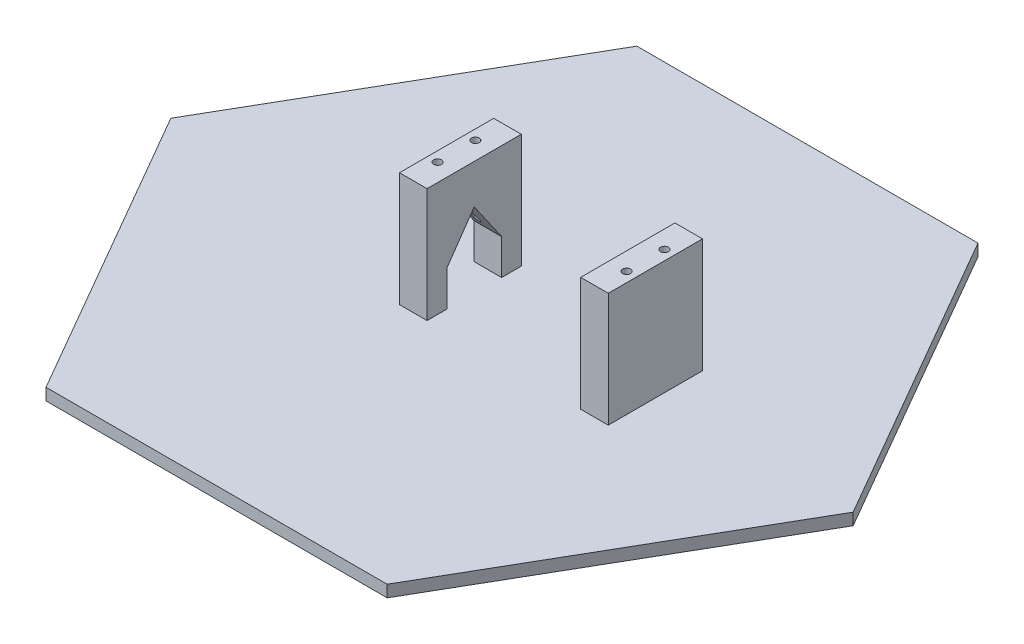
ISO-10303-21;
HEADER;
FILE_DESCRIPTION(('STEP AP214'),'2;1');
FILE_NAME('part.step','',(''),(''),'','','');
FILE_SCHEMA(('AUTOMOTIVE_DESIGN { 1 0 10303 214 1 1 1 1 }'));
ENDSEC;
DATA;
#1=APPLICATION_CONTEXT('core data for automotive mechanical design processes');
#2=APPLICATION_PROTOCOL_DEFINITION('international standard','automotive_design',2000,#1);
#3=PRODUCT_CONTEXT('',#1,'mechanical');
#4=PRODUCT('Part','Part','',(#3));
#5=PRODUCT_RELATED_PRODUCT_CATEGORY('part','',(#4));
#6=PRODUCT_DEFINITION_FORMATION('','',#4);
#7=PRODUCT_DEFINITION_CONTEXT('part definition',#1,'design');
#8=PRODUCT_DEFINITION('design','',#6,#7);
#9=PRODUCT_DEFINITION_SHAPE('','',#8);
#10=(LENGTH_UNIT() NAMED_UNIT(*) SI_UNIT(.MILLI.,.METRE.));
#11=(NAMED_UNIT(*) PLANE_ANGLE_UNIT() SI_UNIT($,.RADIAN.));
#12=(NAMED_UNIT(*) SI_UNIT($,.STERADIAN.) SOLID_ANGLE_UNIT());
#13=UNCERTAINTY_MEASURE_WITH_UNIT(LENGTH_MEASURE(1.E-05),#10,'distance_accuracy_value','');
#14=(GEOMETRIC_REPRESENTATION_CONTEXT(3) GLOBAL_UNCERTAINTY_ASSIGNED_CONTEXT((#13)) GLOBAL_UNIT_ASSIGNED_CONTEXT((#10,
#11,#12)) REPRESENTATION_CONTEXT('',''));
#15=CARTESIAN_POINT('',(0.,0.,0.));
#16=DIRECTION('',(0.,0.,1.));
#17=DIRECTION('',(1.,0.,0.));
#18=AXIS2_PLACEMENT_3D('',#15,#16,#17);
#19=CARTESIAN_POINT('',(-16.6,32.,6.96020627017977));
#20=DIRECTION('',(0.,0.,1.));
#21=DIRECTION('',(1.,0.,0.));
#22=AXIS2_PLACEMENT_3D('',#19,#20,#21);
#23=PLANE('',#22);
#24=DIRECTION('',(-1.,0.,0.));
#25=VECTOR('',#24,1.);
#26=CARTESIAN_POINT('',(14.7675580494599,12.,6.96020627017977));
#27=LINE('',#26,#25);
#28=CARTESIAN_POINT('',(-9.59999999999998,12.,6.96020627017977));
#29=VERTEX_POINT('',#28);
#30=CARTESIAN_POINT('',(-16.6,12.,6.96020627017977));
#31=VERTEX_POINT('',#30);
#32=EDGE_CURVE('E189',#29,#31,#27,.T.);
#33=ORIENTED_EDGE('',*,*,#32,.F.);
#34=DIRECTION('',(0.,-1.,0.));
#35=VECTOR('',#34,1.);
#36=CARTESIAN_POINT('',(-9.6,32.,6.96020627017977));
#37=LINE('',#36,#35);
#38=CARTESIAN_POINT('',(-9.6,3.,6.96020627017977));
#39=VERTEX_POINT('',#38);
#40=EDGE_CURVE('E323',#29,#39,#37,.T.);
#41=ORIENTED_EDGE('',*,*,#40,.T.);
#42=DIRECTION('',(-1.,0.,0.));
#43=VECTOR('',#42,1.);
#44=CARTESIAN_POINT('',(-16.6,3.,6.96020627017977));
#45=LINE('',#44,#43);
#46=CARTESIAN_POINT('',(-16.6,3.,6.96020627017977));
#47=VERTEX_POINT('',#46);
#48=EDGE_CURVE('E307',#39,#47,#45,.T.);
#49=ORIENTED_EDGE('',*,*,#48,.T.);
#50=DIRECTION('',(0.,-1.,0.));
#51=VECTOR('',#50,1.);
#52=CARTESIAN_POINT('',(-16.6,32.,6.96020627017977));
#53=LINE('',#52,#51);
#54=EDGE_CURVE('E306',#31,#47,#53,.T.);
#55=ORIENTED_EDGE('',*,*,#54,.F.);
#56=EDGE_LOOP('',(#33,#41,#49,#55));
#57=FACE_BOUND('',#56,.T.);
#58=ADVANCED_FACE('F45',(#57),#23,.F.);
#59=CARTESIAN_POINT('',(0.,3.,0.));
#60=DIRECTION('',(0.,1.,0.));
#61=DIRECTION('',(0.,0.,1.));
#62=AXIS2_PLACEMENT_3D('',#59,#60,#61);
#63=PLANE('',#62);
#64=DIRECTION('',(0.,0.,1.));
#65=VECTOR('',#64,1.);
#66=CARTESIAN_POINT('',(-16.6,3.,-6.96020627017977));
#67=LINE('',#66,#65);
#68=CARTESIAN_POINT('',(-16.6,3.,-11.9602062701798));
#69=VERTEX_POINT('',#68);
#70=CARTESIAN_POINT('',(-16.6,3.,-6.96020627017977));
#71=VERTEX_POINT('',#70);
#72=EDGE_CURVE('E288',#69,#71,#67,.T.);
#73=ORIENTED_EDGE('',*,*,#72,.F.);
#74=DIRECTION('',(-1.,0.,0.));
#75=VECTOR('',#74,1.);
#76=CARTESIAN_POINT('',(-16.6,3.,-11.9602062701798));
#77=LINE('',#76,#75);
#78=CARTESIAN_POINT('',(-9.6,3.,-11.9602062701798));
#79=VERTEX_POINT('',#78);
#80=EDGE_CURVE('E224',#79,#69,#77,.T.);
#81=ORIENTED_EDGE('',*,*,#80,.F.);
#82=DIRECTION('',(0.,0.,-1.));
#83=VECTOR('',#82,1.);
#84=CARTESIAN_POINT('',(-9.6,3.,-11.9602062701798));
#85=LINE('',#84,#83);
#86=CARTESIAN_POINT('',(-9.6,3.,-6.96020627017977));
#87=VERTEX_POINT('',#86);
#88=EDGE_CURVE('E281',#87,#79,#85,.T.);
#89=ORIENTED_EDGE('',*,*,#88,.F.);
#90=DIRECTION('',(1.,0.,0.));
#91=VECTOR('',#90,1.);
#92=CARTESIAN_POINT('',(-16.6,3.,-6.96020627017977));
#93=LINE('',#92,#91);
#94=EDGE_CURVE('E284',#71,#87,#93,.T.);
#95=ORIENTED_EDGE('',*,*,#94,.F.);
#96=EDGE_LOOP('',(#73,#81,#89,#95));
#97=FACE_BOUND('',#96,.T.);
#98=DIRECTION('',(1.,0.,0.));
#99=VECTOR('',#98,1.);
#100=CARTESIAN_POINT('',(-9.6,3.,11.9602062701798));
#101=LINE('',#100,#99);
#102=CARTESIAN_POINT('',(-16.6,3.,11.9602062701798));
#103=VERTEX_POINT('',#102);
#104=CARTESIAN_POINT('',(-9.6,3.,11.9602062701798));
#105=VERTEX_POINT('',#104);
#106=EDGE_CURVE('E311',#103,#105,#101,.T.);
#107=ORIENTED_EDGE('',*,*,#106,.F.);
#108=DIRECTION('',(0.,0.,1.));
#109=VECTOR('',#108,1.);
#110=CARTESIAN_POINT('',(-16.6,3.,11.9602062701798));
#111=LINE('',#110,#109);
#112=EDGE_CURVE('E268',#47,#103,#111,.T.);
#113=ORIENTED_EDGE('',*,*,#112,.F.);
#114=ORIENTED_EDGE('',*,*,#48,.F.);
#115=DIRECTION('',(0.,0.,-1.));
#116=VECTOR('',#115,1.);
#117=CARTESIAN_POINT('',(-9.6,3.,6.96020627017977));
#118=LINE('',#117,#116);
#119=EDGE_CURVE('E314',#105,#39,#118,.T.);
#120=ORIENTED_EDGE('',*,*,#119,.F.);
#121=EDGE_LOOP('',(#107,#113,#114,#120));
#122=FACE_BOUND('',#121,.T.);
#123=DIRECTION('',(0.499999999999999,0.,-0.866025403784439));
#124=VECTOR('',#123,1.);
#125=CARTESIAN_POINT('',(43.3012701892216,3.,75.0000000000003));
#126=LINE('',#125,#124);
#127=CARTESIAN_POINT('',(43.3012701892216,3.,75.0000000000003));
#128=VERTEX_POINT('',#127);
#129=CARTESIAN_POINT('',(86.6025403784436,3.,0.));
#130=VERTEX_POINT('',#129);
#131=EDGE_CURVE('E334',#128,#130,#126,.T.);
#132=ORIENTED_EDGE('',*,*,#131,.T.);
#133=DIRECTION('',(-0.499999999999999,0.,-0.866025403784439));
#134=VECTOR('',#133,1.);
#135=CARTESIAN_POINT('',(86.6025403784436,3.,0.));
#136=LINE('',#135,#134);
#137=CARTESIAN_POINT('',(43.3012701892215,3.,-75.0000000000006));
#138=VERTEX_POINT('',#137);
#139=EDGE_CURVE('E338',#130,#138,#136,.T.);
#140=ORIENTED_EDGE('',*,*,#139,.T.);
#141=DIRECTION('',(-1.,0.,0.));
#142=VECTOR('',#141,1.);
#143=CARTESIAN_POINT('',(43.3012701892215,3.,-75.0000000000006));
#144=LINE('',#143,#142);
#145=CARTESIAN_POINT('',(-43.301270189222,3.,-75.0000000000006));
#146=VERTEX_POINT('',#145);
#147=EDGE_CURVE('E342',#138,#146,#144,.T.);
#148=ORIENTED_EDGE('',*,*,#147,.T.);
#149=DIRECTION('',(-0.5,0.,0.866025403784439));
#150=VECTOR('',#149,1.);
#151=CARTESIAN_POINT('',(-43.301270189222,3.,-75.0000000000006));
#152=LINE('',#151,#150);
#153=CARTESIAN_POINT('',(-86.6025403784443,3.,-1.25718795044171E-13));
#154=VERTEX_POINT('',#153);
#155=EDGE_CURVE('E345',#146,#154,#152,.T.);
#156=ORIENTED_EDGE('',*,*,#155,.T.);
#157=DIRECTION('',(0.499999999999999,0.,0.866025403784439));
#158=VECTOR('',#157,1.);
#159=CARTESIAN_POINT('',(-86.6025403784443,3.,-1.25718795044171E-13));
#160=LINE('',#159,#158);
#161=CARTESIAN_POINT('',(-43.3012701892223,3.,75.0000000000003));
#162=VERTEX_POINT('',#161);
#163=EDGE_CURVE('E348',#154,#162,#160,.T.);
#164=ORIENTED_EDGE('',*,*,#163,.T.);
#165=DIRECTION('',(1.,0.,0.));
#166=VECTOR('',#165,1.);
#167=CARTESIAN_POINT('',(-43.3012701892223,3.,75.0000000000003));
#168=LINE('',#167,#166);
#169=EDGE_CURVE('E351',#162,#128,#168,.T.);
#170=ORIENTED_EDGE('',*,*,#169,.T.);
#171=EDGE_LOOP('',(#132,#140,#148,#156,#164,#170));
#172=FACE_BOUND('',#171,.T.);
#173=DIRECTION('',(0.,0.,1.));
#174=VECTOR('',#173,1.);
#175=CARTESIAN_POINT('',(29.4,3.,-11.9602062701798));
#176=LINE('',#175,#174);
#177=CARTESIAN_POINT('',(29.4,3.,-11.9602062701798));
#178=VERTEX_POINT('',#177);
#179=CARTESIAN_POINT('',(29.4,3.,11.9602062701798));
#180=VERTEX_POINT('',#179);
#181=EDGE_CURVE('E242',#178,#180,#176,.T.);
#182=ORIENTED_EDGE('',*,*,#181,.F.);
#183=DIRECTION('',(-1.,0.,0.));
#184=VECTOR('',#183,1.);
#185=CARTESIAN_POINT('',(29.4,3.,-11.9602062701798));
#186=LINE('',#185,#184);
#187=CARTESIAN_POINT('',(36.4,3.,-11.9602062701798));
#188=VERTEX_POINT('',#187);
#189=EDGE_CURVE('E245',#188,#178,#186,.T.);
#190=ORIENTED_EDGE('',*,*,#189,.F.);
#191=DIRECTION('',(0.,0.,-1.));
#192=VECTOR('',#191,1.);
#193=CARTESIAN_POINT('',(36.4,3.,11.9602062701798));
#194=LINE('',#193,#192);
#195=CARTESIAN_POINT('',(36.4,3.,11.9602062701798));
#196=VERTEX_POINT('',#195);
#197=EDGE_CURVE('E235',#196,#188,#194,.T.);
#198=ORIENTED_EDGE('',*,*,#197,.F.);
#199=DIRECTION('',(1.,0.,0.));
#200=VECTOR('',#199,1.);
#201=CARTESIAN_POINT('',(29.4,3.,11.9602062701798));
#202=LINE('',#201,#200);
#203=EDGE_CURVE('E238',#180,#196,#202,.T.);
#204=ORIENTED_EDGE('',*,*,#203,.F.);
#205=EDGE_LOOP('',(#182,#190,#198,#204));
#206=FACE_BOUND('',#205,.T.);
#207=ADVANCED_FACE('F404',(#97,#122,#172,#206),#63,.T.);
#208=CARTESIAN_POINT('',(43.3012701892216,3.,75.0000000000003));
#209=DIRECTION('',(-0.866025403784439,0.,-0.5));
#210=DIRECTION('',(-0.5,0.,0.866025403784439));
#211=AXIS2_PLACEMENT_3D('',#208,#209,#210);
#212=PLANE('',#211);
#213=DIRECTION('',(0.499999999999999,0.,-0.866025403784439));
#214=VECTOR('',#213,1.);
#215=CARTESIAN_POINT('',(43.3012701892216,0.,75.0000000000003));
#216=LINE('',#215,#214);
#217=CARTESIAN_POINT('',(43.3012701892216,0.,75.0000000000003));
#218=VERTEX_POINT('',#217);
#219=CARTESIAN_POINT('',(86.6025403784436,0.,0.));
#220=VERTEX_POINT('',#219);
#221=EDGE_CURVE('E333',#218,#220,#216,.T.);
#222=ORIENTED_EDGE('',*,*,#221,.T.);
#223=DIRECTION('',(0.,-1.,0.));
#224=VECTOR('',#223,1.);
#225=CARTESIAN_POINT('',(86.6025403784436,3.,0.));
#226=LINE('',#225,#224);
#227=EDGE_CURVE('E391',#130,#220,#226,.T.);
#228=ORIENTED_EDGE('',*,*,#227,.F.);
#229=ORIENTED_EDGE('',*,*,#131,.F.);
#230=DIRECTION('',(0.,-1.,0.));
#231=VECTOR('',#230,1.);
#232=CARTESIAN_POINT('',(43.3012701892216,3.,75.0000000000003));
#233=LINE('',#232,#231);
#234=EDGE_CURVE('E354',#128,#218,#233,.T.);
#235=ORIENTED_EDGE('',*,*,#234,.T.);
#236=EDGE_LOOP('',(#222,#228,#229,#235));
#237=FACE_BOUND('',#236,.T.);
#238=ADVANCED_FACE('F47',(#237),#212,.F.);
#239=CARTESIAN_POINT('',(86.6025403784436,3.,0.));
#240=DIRECTION('',(-0.866025403784439,0.,0.499999999999999));
#241=DIRECTION('',(0.499999999999999,0.,0.866025403784439));
#242=AXIS2_PLACEMENT_3D('',#239,#240,#241);
#243=PLANE('',#242);
#244=DIRECTION('',(-0.499999999999999,0.,-0.866025403784439));
#245=VECTOR('',#244,1.);
#246=CARTESIAN_POINT('',(86.6025403784436,0.,0.));
#247=LINE('',#246,#245);
#248=CARTESIAN_POINT('',(43.3012701892215,0.,-75.0000000000006));
#249=VERTEX_POINT('',#248);
#250=EDGE_CURVE('E358',#220,#249,#247,.T.);
#251=ORIENTED_EDGE('',*,*,#250,.T.);
#252=DIRECTION('',(0.,-1.,0.));
#253=VECTOR('',#252,1.);
#254=CARTESIAN_POINT('',(43.3012701892215,3.,-75.0000000000006));
#255=LINE('',#254,#253);
#256=EDGE_CURVE('E387',#138,#249,#255,.T.);
#257=ORIENTED_EDGE('',*,*,#256,.F.);
#258=ORIENTED_EDGE('',*,*,#139,.F.);
#259=ORIENTED_EDGE('',*,*,#227,.T.);
#260=EDGE_LOOP('',(#251,#257,#258,#259));
#261=FACE_BOUND('',#260,.T.);
#262=ADVANCED_FACE('F704',(#261),#243,.F.);
#263=CARTESIAN_POINT('',(43.3012701892215,3.,-75.0000000000006));
#264=DIRECTION('',(0.,0.,1.));
#265=DIRECTION('',(1.,0.,0.));
#266=AXIS2_PLACEMENT_3D('',#263,#264,#265);
#267=PLANE('',#266);
#268=DIRECTION('',(-1.,0.,0.));
#269=VECTOR('',#268,1.);
#270=CARTESIAN_POINT('',(43.3012701892215,0.,-75.0000000000006));
#271=LINE('',#270,#269);
#272=CARTESIAN_POINT('',(-43.301270189222,0.,-75.0000000000006));
#273=VERTEX_POINT('',#272);
#274=EDGE_CURVE('E361',#249,#273,#271,.T.);
#275=ORIENTED_EDGE('',*,*,#274,.T.);
#276=DIRECTION('',(0.,-1.,0.));
#277=VECTOR('',#276,1.);
#278=CARTESIAN_POINT('',(-43.301270189222,3.,-75.0000000000006));
#279=LINE('',#278,#277);
#280=EDGE_CURVE('E383',#146,#273,#279,.T.);
#281=ORIENTED_EDGE('',*,*,#280,.F.);
#282=ORIENTED_EDGE('',*,*,#147,.F.);
#283=ORIENTED_EDGE('',*,*,#256,.T.);
#284=EDGE_LOOP('',(#275,#281,#282,#283));
#285=FACE_BOUND('',#284,.T.);
#286=ADVANCED_FACE('F695',(#285),#267,.F.);
#287=CARTESIAN_POINT('',(-43.301270189222,3.,-75.0000000000006));
#288=DIRECTION('',(0.866025403784438,0.,0.5));
#289=DIRECTION('',(0.5,0.,-0.866025403784439));
#290=AXIS2_PLACEMENT_3D('',#287,#288,#289);
#291=PLANE('',#290);
#292=DIRECTION('',(-0.5,0.,0.866025403784439));
#293=VECTOR('',#292,1.);
#294=CARTESIAN_POINT('',(-43.301270189222,0.,-75.0000000000006));
#295=LINE('',#294,#293);
#296=CARTESIAN_POINT('',(-86.6025403784443,0.,-1.25718795044171E-13));
#297=VERTEX_POINT('',#296);
#298=EDGE_CURVE('E364',#273,#297,#295,.T.);
#299=ORIENTED_EDGE('',*,*,#298,.T.);
#300=DIRECTION('',(0.,-1.,0.));
#301=VECTOR('',#300,1.);
#302=CARTESIAN_POINT('',(-86.6025403784443,3.,-1.25718795044171E-13));
#303=LINE('',#302,#301);
#304=EDGE_CURVE('E379',#154,#297,#303,.T.);
#305=ORIENTED_EDGE('',*,*,#304,.F.);
#306=ORIENTED_EDGE('',*,*,#155,.F.);
#307=ORIENTED_EDGE('',*,*,#280,.T.);
#308=EDGE_LOOP('',(#299,#305,#306,#307));
#309=FACE_BOUND('',#308,.T.);
#310=ADVANCED_FACE('F686',(#309),#291,.F.);
#311=CARTESIAN_POINT('',(-86.6025403784443,3.,-1.25718795044171E-13));
#312=DIRECTION('',(0.866025403784439,0.,-0.499999999999999));
#313=DIRECTION('',(-0.499999999999999,0.,-0.866025403784439));
#314=AXIS2_PLACEMENT_3D('',#311,#312,#313);
#315=PLANE('',#314);
#316=DIRECTION('',(0.499999999999999,0.,0.866025403784439));
#317=VECTOR('',#316,1.);
#318=CARTESIAN_POINT('',(-86.6025403784443,0.,-1.25718795044171E-13));
#319=LINE('',#318,#317);
#320=CARTESIAN_POINT('',(-43.3012701892223,0.,75.0000000000003));
#321=VERTEX_POINT('',#320);
#322=EDGE_CURVE('E367',#297,#321,#319,.T.);
#323=ORIENTED_EDGE('',*,*,#322,.T.);
#324=DIRECTION('',(0.,-1.,0.));
#325=VECTOR('',#324,1.);
#326=CARTESIAN_POINT('',(-43.3012701892223,3.,75.0000000000003));
#327=LINE('',#326,#325);
#328=EDGE_CURVE('E375',#162,#321,#327,.T.);
#329=ORIENTED_EDGE('',*,*,#328,.F.);
#330=ORIENTED_EDGE('',*,*,#163,.F.);
#331=ORIENTED_EDGE('',*,*,#304,.T.);
#332=EDGE_LOOP('',(#323,#329,#330,#331));
#333=FACE_BOUND('',#332,.T.);
#334=ADVANCED_FACE('F677',(#333),#315,.F.);
#335=CARTESIAN_POINT('',(-43.3012701892223,3.,75.0000000000003));
#336=DIRECTION('',(0.,0.,-1.));
#337=DIRECTION('',(-1.,0.,0.));
#338=AXIS2_PLACEMENT_3D('',#335,#336,#337);
#339=PLANE('',#338);
#340=DIRECTION('',(1.,0.,0.));
#341=VECTOR('',#340,1.);
#342=CARTESIAN_POINT('',(-43.3012701892223,0.,75.0000000000003));
#343=LINE('',#342,#341);
#344=EDGE_CURVE('E339',#321,#218,#343,.T.);
#345=ORIENTED_EDGE('',*,*,#344,.T.);
#346=ORIENTED_EDGE('',*,*,#234,.F.);
#347=ORIENTED_EDGE('',*,*,#169,.F.);
#348=ORIENTED_EDGE('',*,*,#328,.T.);
#349=EDGE_LOOP('',(#345,#346,#347,#348));
#350=FACE_BOUND('',#349,.T.);
#351=ADVANCED_FACE('F437',(#350),#339,.F.);
#352=CARTESIAN_POINT('',(0.,0.,0.));
#353=DIRECTION('',(0.,1.,0.));
#354=DIRECTION('',(0.,0.,1.));
#355=AXIS2_PLACEMENT_3D('',#352,#353,#354);
#356=PLANE('',#355);
#357=ORIENTED_EDGE('',*,*,#221,.F.);
#358=ORIENTED_EDGE('',*,*,#344,.F.);
#359=ORIENTED_EDGE('',*,*,#322,.F.);
#360=ORIENTED_EDGE('',*,*,#298,.F.);
#361=ORIENTED_EDGE('',*,*,#274,.F.);
#362=ORIENTED_EDGE('',*,*,#250,.F.);
#363=EDGE_LOOP('',(#357,#358,#359,#360,#361,#362));
#364=FACE_BOUND('',#363,.T.);
#365=ADVANCED_FACE('F429',(#364),#356,.F.);
#366=CARTESIAN_POINT('',(-9.6,32.,11.9602062701798));
#367=DIRECTION('',(0.,0.,-1.));
#368=DIRECTION('',(-1.,0.,0.));
#369=AXIS2_PLACEMENT_3D('',#366,#367,#368);
#370=PLANE('',#369);
#371=ORIENTED_EDGE('',*,*,#106,.T.);
#372=DIRECTION('',(0.,-1.,0.));
#373=VECTOR('',#372,1.);
#374=CARTESIAN_POINT('',(-9.6,32.,11.9602062701798));
#375=LINE('',#374,#373);
#376=CARTESIAN_POINT('',(-9.6,32.,11.9602062701798));
#377=VERTEX_POINT('',#376);
#378=EDGE_CURVE('E326',#377,#105,#375,.T.);
#379=ORIENTED_EDGE('',*,*,#378,.F.);
#380=DIRECTION('',(1.,0.,0.));
#381=VECTOR('',#380,1.);
#382=CARTESIAN_POINT('',(-9.6,32.,11.9602062701798));
#383=LINE('',#382,#381);
#384=CARTESIAN_POINT('',(-16.6,32.,11.9602062701798));
#385=VERTEX_POINT('',#384);
#386=EDGE_CURVE('E302',#385,#377,#383,.T.);
#387=ORIENTED_EDGE('',*,*,#386,.F.);
#388=DIRECTION('',(0.,-1.,0.));
#389=VECTOR('',#388,1.);
#390=CARTESIAN_POINT('',(-16.6,32.,11.9602062701798));
#391=LINE('',#390,#389);
#392=EDGE_CURVE('E330',#385,#103,#391,.T.);
#393=ORIENTED_EDGE('',*,*,#392,.T.);
#394=EDGE_LOOP('',(#371,#379,#387,#393));
#395=FACE_BOUND('',#394,.T.);
#396=ADVANCED_FACE('F426',(#395),#370,.F.);
#397=CARTESIAN_POINT('',(-16.6,32.,-11.9602062701798));
#398=DIRECTION('',(0.,0.,1.));
#399=DIRECTION('',(1.,0.,0.));
#400=AXIS2_PLACEMENT_3D('',#397,#398,#399);
#401=PLANE('',#400);
#402=ORIENTED_EDGE('',*,*,#80,.T.);
#403=DIRECTION('',(0.,-1.,0.));
#404=VECTOR('',#403,1.);
#405=CARTESIAN_POINT('',(-16.6,32.,-11.9602062701798));
#406=LINE('',#405,#404);
#407=CARTESIAN_POINT('',(-16.6,32.,-11.9602062701798));
#408=VERTEX_POINT('',#407);
#409=EDGE_CURVE('E269',#408,#69,#406,.T.);
#410=ORIENTED_EDGE('',*,*,#409,.F.);
#411=DIRECTION('',(-1.,0.,0.));
#412=VECTOR('',#411,1.);
#413=CARTESIAN_POINT('',(-16.6,32.,-11.9602062701798));
#414=LINE('',#413,#412);
#415=CARTESIAN_POINT('',(-9.6,32.,-11.9602062701798));
#416=VERTEX_POINT('',#415);
#417=EDGE_CURVE('E285',#416,#408,#414,.T.);
#418=ORIENTED_EDGE('',*,*,#417,.F.);
#419=DIRECTION('',(0.,-1.,0.));
#420=VECTOR('',#419,1.);
#421=CARTESIAN_POINT('',(-9.6,32.,-11.9602062701798));
#422=LINE('',#421,#420);
#423=EDGE_CURVE('E276',#416,#79,#422,.T.);
#424=ORIENTED_EDGE('',*,*,#423,.T.);
#425=EDGE_LOOP('',(#402,#410,#418,#424));
#426=FACE_BOUND('',#425,.T.);
#427=ADVANCED_FACE('F428',(#426),#401,.F.);
#428=CARTESIAN_POINT('',(-16.6,32.,-6.96020627017977));
#429=DIRECTION('',(1.,0.,0.));
#430=DIRECTION('',(0.,0.,-1.));
#431=AXIS2_PLACEMENT_3D('',#428,#429,#430);
#432=PLANE('',#431);
#433=ORIENTED_EDGE('',*,*,#72,.T.);
#434=DIRECTION('',(0.,-1.,0.));
#435=VECTOR('',#434,1.);
#436=CARTESIAN_POINT('',(-16.6,32.,-6.96020627017977));
#437=LINE('',#436,#435);
#438=CARTESIAN_POINT('',(-16.6,12.,-6.96020627017977));
#439=VERTEX_POINT('',#438);
#440=EDGE_CURVE('E202',#439,#71,#437,.T.);
#441=ORIENTED_EDGE('',*,*,#440,.F.);
#442=DIRECTION('',(0.,0.820763408438593,0.571268262174841));
#443=VECTOR('',#442,1.);
#444=CARTESIAN_POINT('',(-16.6,12.,-6.96020627017977));
#445=LINE('',#444,#443);
#446=CARTESIAN_POINT('',(-16.6,22.,0.));
#447=VERTEX_POINT('',#446);
#448=EDGE_CURVE('E184',#439,#447,#445,.T.);
#449=ORIENTED_EDGE('',*,*,#448,.T.);
#450=DIRECTION('',(0.,0.820763408438593,-0.571268262174841));
#451=VECTOR('',#450,1.);
#452=CARTESIAN_POINT('',(-16.6,12.,6.96020627017977));
#453=LINE('',#452,#451);
#454=EDGE_CURVE('E190',#31,#447,#453,.T.);
#455=ORIENTED_EDGE('',*,*,#454,.F.);
#456=ORIENTED_EDGE('',*,*,#54,.T.);
#457=ORIENTED_EDGE('',*,*,#112,.T.);
#458=ORIENTED_EDGE('',*,*,#392,.F.);
#459=DIRECTION('',(0.,0.,1.));
#460=VECTOR('',#459,1.);
#461=CARTESIAN_POINT('',(-16.6,32.,-6.96020627017977));
#462=LINE('',#461,#460);
#463=EDGE_CURVE('E296',#408,#385,#462,.T.);
#464=ORIENTED_EDGE('',*,*,#463,.F.);
#465=ORIENTED_EDGE('',*,*,#409,.T.);
#466=EDGE_LOOP('',(#433,#441,#449,#455,#456,#457,#458,#464,#465));
#467=FACE_BOUND('',#466,.T.);
#468=ADVANCED_FACE('F201',(#467),#432,.F.);
#469=CARTESIAN_POINT('',(-16.6,32.,-6.96020627017977));
#470=DIRECTION('',(0.,0.,-1.));
#471=DIRECTION('',(-1.,0.,0.));
#472=AXIS2_PLACEMENT_3D('',#469,#470,#471);
#473=PLANE('',#472);
#474=DIRECTION('',(0.,-1.,0.));
#475=VECTOR('',#474,1.);
#476=CARTESIAN_POINT('',(-9.6,32.,-6.96020627017977));
#477=LINE('',#476,#475);
#478=CARTESIAN_POINT('',(-9.6,12.,-6.96020627017977));
#479=VERTEX_POINT('',#478);
#480=EDGE_CURVE('E69',#479,#87,#477,.T.);
#481=ORIENTED_EDGE('',*,*,#480,.F.);
#482=DIRECTION('',(-1.,0.,0.));
#483=VECTOR('',#482,1.);
#484=CARTESIAN_POINT('',(14.7675580494599,12.,-6.96020627017977));
#485=LINE('',#484,#483);
#486=EDGE_CURVE('E212',#479,#439,#485,.T.);
#487=ORIENTED_EDGE('',*,*,#486,.T.);
#488=ORIENTED_EDGE('',*,*,#440,.T.);
#489=ORIENTED_EDGE('',*,*,#94,.T.);
#490=EDGE_LOOP('',(#481,#487,#488,#489));
#491=FACE_BOUND('',#490,.T.);
#492=ADVANCED_FACE('F453',(#491),#473,.F.);
#493=CARTESIAN_POINT('',(-9.6,32.,-11.9602062701798));
#494=DIRECTION('',(-1.,0.,0.));
#495=DIRECTION('',(0.,0.,1.));
#496=AXIS2_PLACEMENT_3D('',#493,#494,#495);
#497=PLANE('',#496);
#498=ORIENTED_EDGE('',*,*,#88,.T.);
#499=ORIENTED_EDGE('',*,*,#423,.F.);
#500=DIRECTION('',(0.,0.,-1.));
#501=VECTOR('',#500,1.);
#502=CARTESIAN_POINT('',(-9.6,32.,-11.9602062701798));
#503=LINE('',#502,#501);
#504=EDGE_CURVE('E280',#377,#416,#503,.T.);
#505=ORIENTED_EDGE('',*,*,#504,.F.);
#506=ORIENTED_EDGE('',*,*,#378,.T.);
#507=ORIENTED_EDGE('',*,*,#119,.T.);
#508=ORIENTED_EDGE('',*,*,#40,.F.);
#509=DIRECTION('',(0.,-0.820763408438593,0.571268262174841));
#510=VECTOR('',#509,1.);
#511=CARTESIAN_POINT('',(-9.59999999999998,12.,6.96020627017978));
#512=LINE('',#511,#510);
#513=CARTESIAN_POINT('',(-9.59999999999999,22.,0.));
#514=VERTEX_POINT('',#513);
#515=EDGE_CURVE('E215',#514,#29,#512,.T.);
#516=ORIENTED_EDGE('',*,*,#515,.F.);
#517=DIRECTION('',(0.,-0.820763408438593,-0.571268262174841));
#518=VECTOR('',#517,1.);
#519=CARTESIAN_POINT('',(-9.6,12.,-6.96020627017976));
#520=LINE('',#519,#518);
#521=EDGE_CURVE('E186',#514,#479,#520,.T.);
#522=ORIENTED_EDGE('',*,*,#521,.T.);
#523=ORIENTED_EDGE('',*,*,#480,.T.);
#524=EDGE_LOOP('',(#498,#499,#505,#506,#507,#508,#516,#522,#523));
#525=FACE_BOUND('',#524,.T.);
#526=ADVANCED_FACE('F446',(#525),#497,.F.);
#527=CARTESIAN_POINT('',(0.,32.,0.));
#528=DIRECTION('',(0.,-1.,0.));
#529=DIRECTION('',(0.,0.,-1.));
#530=AXIS2_PLACEMENT_3D('',#527,#528,#529);
#531=PLANE('',#530);
#532=CARTESIAN_POINT('',(-14.1,32.,4.8));
#533=DIRECTION('',(0.,-1.,0.));
#534=DIRECTION('',(0.,0.,-1.));
#535=AXIS2_PLACEMENT_3D('',#532,#533,#534);
#536=CIRCLE('',#535,1.);
#537=CARTESIAN_POINT('',(-14.1,32.,3.8));
#538=VERTEX_POINT('',#537);
#539=EDGE_CURVE('E475',#538,#538,#536,.T.);
#540=ORIENTED_EDGE('',*,*,#539,.T.);
#541=EDGE_LOOP('',(#540));
#542=FACE_BOUND('',#541,.T.);
#543=CARTESIAN_POINT('',(-14.1,32.,-4.8));
#544=DIRECTION('',(0.,-1.,0.));
#545=DIRECTION('',(0.,0.,-1.));
#546=AXIS2_PLACEMENT_3D('',#543,#544,#545);
#547=CIRCLE('',#546,1.);
#548=CARTESIAN_POINT('',(-14.1,32.,-5.8));
#549=VERTEX_POINT('',#548);
#550=EDGE_CURVE('E478',#549,#549,#547,.T.);
#551=ORIENTED_EDGE('',*,*,#550,.T.);
#552=EDGE_LOOP('',(#551));
#553=FACE_BOUND('',#552,.T.);
#554=ORIENTED_EDGE('',*,*,#417,.T.);
#555=ORIENTED_EDGE('',*,*,#463,.T.);
#556=ORIENTED_EDGE('',*,*,#386,.T.);
#557=ORIENTED_EDGE('',*,*,#504,.T.);
#558=EDGE_LOOP('',(#554,#555,#556,#557));
#559=FACE_BOUND('',#558,.T.);
#560=ADVANCED_FACE('F424',(#542,#553,#559),#531,.F.);
#561=CARTESIAN_POINT('',(0.,32.,0.));
#562=DIRECTION('',(0.,1.,0.));
#563=DIRECTION('',(0.,0.,1.));
#564=AXIS2_PLACEMENT_3D('',#561,#562,#563);
#565=PLANE('',#564);
#566=CARTESIAN_POINT('',(33.9,32.,4.79999999999999));
#567=DIRECTION('',(0.,1.,0.));
#568=DIRECTION('',(0.,0.,1.));
#569=AXIS2_PLACEMENT_3D('',#566,#567,#568);
#570=CIRCLE('',#569,0.999999999999998);
#571=CARTESIAN_POINT('',(33.9,32.,3.79999999999999));
#572=VERTEX_POINT('',#571);
#573=EDGE_CURVE('E249',#572,#572,#570,.T.);
#574=ORIENTED_EDGE('',*,*,#573,.F.);
#575=EDGE_LOOP('',(#574));
#576=FACE_BOUND('',#575,.T.);
#577=DIRECTION('',(-1.,0.,0.));
#578=VECTOR('',#577,1.);
#579=CARTESIAN_POINT('',(29.4,32.,-11.9602062701798));
#580=LINE('',#579,#578);
#581=CARTESIAN_POINT('',(36.4,32.,-11.9602062701798));
#582=VERTEX_POINT('',#581);
#583=CARTESIAN_POINT('',(29.4,32.,-11.9602062701798));
#584=VERTEX_POINT('',#583);
#585=EDGE_CURVE('E239',#582,#584,#580,.T.);
#586=ORIENTED_EDGE('',*,*,#585,.T.);
#587=DIRECTION('',(0.,0.,1.));
#588=VECTOR('',#587,1.);
#589=CARTESIAN_POINT('',(29.4,32.,-11.9602062701798));
#590=LINE('',#589,#588);
#591=CARTESIAN_POINT('',(29.4,32.,11.9602062701798));
#592=VERTEX_POINT('',#591);
#593=EDGE_CURVE('E255',#584,#592,#590,.T.);
#594=ORIENTED_EDGE('',*,*,#593,.T.);
#595=DIRECTION('',(1.,0.,0.));
#596=VECTOR('',#595,1.);
#597=CARTESIAN_POINT('',(29.4,32.,11.9602062701798));
#598=LINE('',#597,#596);
#599=CARTESIAN_POINT('',(36.4,32.,11.9602062701798));
#600=VERTEX_POINT('',#599);
#601=EDGE_CURVE('E252',#592,#600,#598,.T.);
#602=ORIENTED_EDGE('',*,*,#601,.T.);
#603=DIRECTION('',(0.,0.,-1.));
#604=VECTOR('',#603,1.);
#605=CARTESIAN_POINT('',(36.4,32.,11.9602062701798));
#606=LINE('',#605,#604);
#607=EDGE_CURVE('E234',#600,#582,#606,.T.);
#608=ORIENTED_EDGE('',*,*,#607,.T.);
#609=EDGE_LOOP('',(#586,#594,#602,#608));
#610=FACE_BOUND('',#609,.T.);
#611=CARTESIAN_POINT('',(33.9,32.,-4.80000000000001));
#612=DIRECTION('',(0.,1.,0.));
#613=DIRECTION('',(0.,0.,-1.));
#614=AXIS2_PLACEMENT_3D('',#611,#612,#613);
#615=CIRCLE('',#614,0.999999999999998);
#616=CARTESIAN_POINT('',(33.9,32.,-5.8));
#617=VERTEX_POINT('',#616);
#618=EDGE_CURVE('E264',#617,#617,#615,.T.);
#619=ORIENTED_EDGE('',*,*,#618,.F.);
#620=EDGE_LOOP('',(#619));
#621=FACE_BOUND('',#620,.T.);
#622=ADVANCED_FACE('F462',(#576,#610,#621),#565,.T.);
#623=CARTESIAN_POINT('',(29.4,32.,-11.9602062701798));
#624=DIRECTION('',(0.,0.,1.));
#625=DIRECTION('',(1.,0.,0.));
#626=AXIS2_PLACEMENT_3D('',#623,#624,#625);
#627=PLANE('',#626);
#628=ORIENTED_EDGE('',*,*,#189,.T.);
#629=DIRECTION('',(0.,-1.,0.));
#630=VECTOR('',#629,1.);
#631=CARTESIAN_POINT('',(29.4,32.,-11.9602062701798));
#632=LINE('',#631,#630);
#633=EDGE_CURVE('E220',#584,#178,#632,.T.);
#634=ORIENTED_EDGE('',*,*,#633,.F.);
#635=ORIENTED_EDGE('',*,*,#585,.F.);
#636=DIRECTION('',(0.,-1.,0.));
#637=VECTOR('',#636,1.);
#638=CARTESIAN_POINT('',(36.4,32.,-11.9602062701798));
#639=LINE('',#638,#637);
#640=EDGE_CURVE('E230',#582,#188,#639,.T.);
#641=ORIENTED_EDGE('',*,*,#640,.T.);
#642=EDGE_LOOP('',(#628,#634,#635,#641));
#643=FACE_BOUND('',#642,.T.);
#644=ADVANCED_FACE('F468',(#643),#627,.F.);
#645=CARTESIAN_POINT('',(29.4,32.,-11.9602062701798));
#646=DIRECTION('',(1.,0.,0.));
#647=DIRECTION('',(0.,0.,-1.));
#648=AXIS2_PLACEMENT_3D('',#645,#646,#647);
#649=PLANE('',#648);
#650=ORIENTED_EDGE('',*,*,#181,.T.);
#651=DIRECTION('',(0.,-1.,0.));
#652=VECTOR('',#651,1.);
#653=CARTESIAN_POINT('',(29.4,32.,11.9602062701798));
#654=LINE('',#653,#652);
#655=EDGE_CURVE('E223',#592,#180,#654,.T.);
#656=ORIENTED_EDGE('',*,*,#655,.F.);
#657=ORIENTED_EDGE('',*,*,#593,.F.);
#658=ORIENTED_EDGE('',*,*,#633,.T.);
#659=EDGE_LOOP('',(#650,#656,#657,#658));
#660=FACE_BOUND('',#659,.T.);
#661=ADVANCED_FACE('F504',(#660),#649,.F.);
#662=CARTESIAN_POINT('',(29.4,32.,11.9602062701798));
#663=DIRECTION('',(0.,0.,-1.));
#664=DIRECTION('',(-1.,0.,0.));
#665=AXIS2_PLACEMENT_3D('',#662,#663,#664);
#666=PLANE('',#665);
#667=ORIENTED_EDGE('',*,*,#203,.T.);
#668=DIRECTION('',(0.,-1.,0.));
#669=VECTOR('',#668,1.);
#670=CARTESIAN_POINT('',(36.4,32.,11.9602062701798));
#671=LINE('',#670,#669);
#672=EDGE_CURVE('E61',#600,#196,#671,.T.);
#673=ORIENTED_EDGE('',*,*,#672,.F.);
#674=ORIENTED_EDGE('',*,*,#601,.F.);
#675=ORIENTED_EDGE('',*,*,#655,.T.);
#676=EDGE_LOOP('',(#667,#673,#674,#675));
#677=FACE_BOUND('',#676,.T.);
#678=ADVANCED_FACE('F508',(#677),#666,.F.);
#679=CARTESIAN_POINT('',(36.4,32.,11.9602062701798));
#680=DIRECTION('',(-1.,0.,0.));
#681=DIRECTION('',(0.,0.,1.));
#682=AXIS2_PLACEMENT_3D('',#679,#680,#681);
#683=PLANE('',#682);
#684=ORIENTED_EDGE('',*,*,#197,.T.);
#685=ORIENTED_EDGE('',*,*,#640,.F.);
#686=ORIENTED_EDGE('',*,*,#607,.F.);
#687=ORIENTED_EDGE('',*,*,#672,.T.);
#688=EDGE_LOOP('',(#684,#685,#686,#687));
#689=FACE_BOUND('',#688,.T.);
#690=ADVANCED_FACE('F512',(#689),#683,.F.);
#691=CARTESIAN_POINT('',(33.9,32.,4.79999999999999));
#692=DIRECTION('',(0.,-1.,0.));
#693=DIRECTION('',(0.,0.,-1.));
#694=AXIS2_PLACEMENT_3D('',#691,#692,#693);
#695=CYLINDRICAL_SURFACE('',#694,0.999999999999998);
#696=CARTESIAN_POINT('',(33.9,3.,4.79999999999999));
#697=DIRECTION('',(0.,1.,0.));
#698=DIRECTION('',(0.,0.,1.));
#699=AXIS2_PLACEMENT_3D('',#696,#697,#698);
#700=CIRCLE('',#699,0.999999999999998);
#701=CARTESIAN_POINT('',(33.9,3.,3.79999999999999));
#702=VERTEX_POINT('',#701);
#703=EDGE_CURVE('E11',#702,#702,#700,.F.);
#704=CARTESIAN_POINT('',(33.9,32.,3.79999999999999));
#705=CARTESIAN_POINT('',(33.9,31.6979166666667,3.79999999999999));
#706=CARTESIAN_POINT('',(33.9,31.3958333333333,3.79999999999999));
#707=CARTESIAN_POINT('',(33.9,30.7916666666667,3.79999999999999));
#708=CARTESIAN_POINT('',(33.9,30.4895833333333,3.79999999999999));
#709=CARTESIAN_POINT('',(33.9,29.8854166666667,3.79999999999999));
#710=CARTESIAN_POINT('',(33.9,29.5833333333333,3.79999999999999));
#711=CARTESIAN_POINT('',(33.9,28.9791666666667,3.79999999999999));
#712=CARTESIAN_POINT('',(33.9,28.6770833333333,3.79999999999999));
#713=CARTESIAN_POINT('',(33.9,28.0729166666667,3.79999999999999));
#714=CARTESIAN_POINT('',(33.9,27.7708333333333,3.79999999999999));
#715=CARTESIAN_POINT('',(33.9,27.1666666666667,3.79999999999999));
#716=CARTESIAN_POINT('',(33.9,26.8645833333333,3.79999999999999));
#717=CARTESIAN_POINT('',(33.9,26.2604166666667,3.79999999999999));
#718=CARTESIAN_POINT('',(33.9,25.9583333333333,3.79999999999999));
#719=CARTESIAN_POINT('',(33.9,25.3541666666667,3.79999999999999));
#720=CARTESIAN_POINT('',(33.9,25.0520833333333,3.79999999999999));
#721=CARTESIAN_POINT('',(33.9,24.4479166666667,3.79999999999999));
#722=CARTESIAN_POINT('',(33.9,24.1458333333333,3.79999999999999));
#723=CARTESIAN_POINT('',(33.9,23.5416666666667,3.79999999999999));
#724=CARTESIAN_POINT('',(33.9,23.2395833333333,3.79999999999999));
#725=CARTESIAN_POINT('',(33.9,22.6354166666667,3.79999999999999));
#726=CARTESIAN_POINT('',(33.9,22.3333333333333,3.79999999999999));
#727=CARTESIAN_POINT('',(33.9,21.7291666666667,3.79999999999999));
#728=CARTESIAN_POINT('',(33.9,21.4270833333333,3.79999999999999));
#729=CARTESIAN_POINT('',(33.9,20.8229166666667,3.79999999999999));
#730=CARTESIAN_POINT('',(33.9,20.5208333333333,3.79999999999999));
#731=CARTESIAN_POINT('',(33.9,19.9166666666667,3.79999999999999));
#732=CARTESIAN_POINT('',(33.9,19.6145833333333,3.79999999999999));
#733=CARTESIAN_POINT('',(33.9,19.0104166666667,3.79999999999999));
#734=CARTESIAN_POINT('',(33.9,18.7083333333333,3.79999999999999));
#735=CARTESIAN_POINT('',(33.9,18.1041666666667,3.79999999999999));
#736=CARTESIAN_POINT('',(33.9,17.8020833333333,3.79999999999999));
#737=CARTESIAN_POINT('',(33.9,17.1979166666667,3.79999999999999));
#738=CARTESIAN_POINT('',(33.9,16.8958333333333,3.79999999999999));
#739=CARTESIAN_POINT('',(33.9,16.2916666666667,3.79999999999999));
#740=CARTESIAN_POINT('',(33.9,15.9895833333333,3.79999999999999));
#741=CARTESIAN_POINT('',(33.9,15.3854166666667,3.79999999999999));
#742=CARTESIAN_POINT('',(33.9,15.0833333333333,3.79999999999999));
#743=CARTESIAN_POINT('',(33.9,14.4791666666667,3.79999999999999));
#744=CARTESIAN_POINT('',(33.9,14.1770833333333,3.79999999999999));
#745=CARTESIAN_POINT('',(33.9,13.5729166666667,3.79999999999999));
#746=CARTESIAN_POINT('',(33.9,13.2708333333333,3.79999999999999));
#747=CARTESIAN_POINT('',(33.9,12.6666666666667,3.79999999999999));
#748=CARTESIAN_POINT('',(33.9,12.3645833333333,3.79999999999999));
#749=CARTESIAN_POINT('',(33.9,11.7604166666667,3.79999999999999));
#750=CARTESIAN_POINT('',(33.9,11.4583333333333,3.79999999999999));
#751=CARTESIAN_POINT('',(33.9,10.8541666666667,3.79999999999999));
#752=CARTESIAN_POINT('',(33.9,10.5520833333333,3.79999999999999));
#753=CARTESIAN_POINT('',(33.9,9.94791666666667,3.79999999999999));
#754=CARTESIAN_POINT('',(33.9,9.64583333333333,3.79999999999999));
#755=CARTESIAN_POINT('',(33.9,9.04166666666666,3.79999999999999));
#756=CARTESIAN_POINT('',(33.9,8.73958333333333,3.79999999999999));
#757=CARTESIAN_POINT('',(33.9,8.13541666666667,3.79999999999999));
#758=CARTESIAN_POINT('',(33.9,7.83333333333333,3.79999999999999));
#759=CARTESIAN_POINT('',(33.9,7.22916666666667,3.79999999999999));
#760=CARTESIAN_POINT('',(33.9,6.92708333333333,3.79999999999999));
#761=CARTESIAN_POINT('',(33.9,6.32291666666667,3.79999999999999));
#762=CARTESIAN_POINT('',(33.9,6.02083333333333,3.79999999999999));
#763=CARTESIAN_POINT('',(33.9,5.41666666666667,3.79999999999999));
#764=CARTESIAN_POINT('',(33.9,5.11458333333333,3.79999999999999));
#765=CARTESIAN_POINT('',(33.9,4.51041666666667,3.79999999999999));
#766=CARTESIAN_POINT('',(33.9,4.20833333333333,3.79999999999999));
#767=CARTESIAN_POINT('',(33.9,3.60416666666667,3.79999999999999));
#768=CARTESIAN_POINT('',(33.9,3.30208333333333,3.79999999999999));
#769=CARTESIAN_POINT('',(33.9,3.,3.79999999999999));
#770=B_SPLINE_CURVE_WITH_KNOTS('',3,(#704,#705,#706,#707,#708,#709,#710,#711,#712,#713,#714,
#715,#716,#717,#718,#719,#720,#721,#722,#723,#724,#725,#726,#727,#728,#729,#730,#731,#732,#733,
#734,#735,#736,#737,#738,#739,#740,#741,#742,#743,#744,#745,#746,#747,#748,#749,#750,#751,#752,
#753,#754,#755,#756,#757,#758,#759,#760,#761,#762,#763,#764,#765,#766,#767,#768,#769),
.UNSPECIFIED.,.F.,.F.,(4,2,2,2,2,2,2,2,2,2,2,2,2,2,2,2,2,2,2,2,2,2,2,2,2,2,2,2,2,2,2,2,4),(0.,
0.906249999999997,1.81249999999999,2.71875,3.625,4.53125,5.4375,6.34375,7.25,8.15625,
9.06249999999999,9.96874999999999,10.875,11.78125,12.6875,13.59375,14.5,15.40625,16.3125,
17.21875,18.125,19.03125,19.9375,20.84375,21.75,22.65625,23.5625,24.46875,25.375,26.28125,
27.1875,28.09375,29.),.UNSPECIFIED.);
#771=EDGE_CURVE('BSEAM410',#572,#702,#770,.T.);
#772=ORIENTED_EDGE('',*,*,#573,.T.);
#773=ORIENTED_EDGE('',*,*,#703,.T.);
#774=ORIENTED_EDGE('',*,*,#771,.T.);
#775=ORIENTED_EDGE('',*,*,#771,.F.);
#776=EDGE_LOOP('',(#772,#774,#773,#775));
#777=FACE_BOUND('',#776,.T.);
#778=ADVANCED_FACE('F410',(#777),#695,.F.);
#779=CARTESIAN_POINT('',(33.9,32.,-4.80000000000001));
#780=DIRECTION('',(0.,-1.,0.));
#781=DIRECTION('',(0.,0.,-1.));
#782=AXIS2_PLACEMENT_3D('',#779,#780,#781);
#783=CYLINDRICAL_SURFACE('',#782,0.999999999999998);
#784=CARTESIAN_POINT('',(33.9,3.,-4.80000000000001));
#785=DIRECTION('',(0.,1.,0.));
#786=DIRECTION('',(0.,0.,1.));
#787=AXIS2_PLACEMENT_3D('',#784,#785,#786);
#788=CIRCLE('',#787,0.999999999999998);
#789=CARTESIAN_POINT('',(33.9,3.,-5.8));
#790=VERTEX_POINT('',#789);
#791=EDGE_CURVE('E54',#790,#790,#788,.F.);
#792=CARTESIAN_POINT('',(33.9,32.,-5.8));
#793=CARTESIAN_POINT('',(33.9,31.6979166666667,-5.8));
#794=CARTESIAN_POINT('',(33.9,31.3958333333333,-5.8));
#795=CARTESIAN_POINT('',(33.9,30.7916666666667,-5.8));
#796=CARTESIAN_POINT('',(33.9,30.4895833333333,-5.8));
#797=CARTESIAN_POINT('',(33.9,29.8854166666667,-5.8));
#798=CARTESIAN_POINT('',(33.9,29.5833333333333,-5.8));
#799=CARTESIAN_POINT('',(33.9,28.9791666666667,-5.8));
#800=CARTESIAN_POINT('',(33.9,28.6770833333333,-5.8));
#801=CARTESIAN_POINT('',(33.9,28.0729166666667,-5.8));
#802=CARTESIAN_POINT('',(33.9,27.7708333333333,-5.8));
#803=CARTESIAN_POINT('',(33.9,27.1666666666667,-5.8));
#804=CARTESIAN_POINT('',(33.9,26.8645833333333,-5.8));
#805=CARTESIAN_POINT('',(33.9,26.2604166666667,-5.8));
#806=CARTESIAN_POINT('',(33.9,25.9583333333333,-5.8));
#807=CARTESIAN_POINT('',(33.9,25.3541666666667,-5.8));
#808=CARTESIAN_POINT('',(33.9,25.0520833333333,-5.8));
#809=CARTESIAN_POINT('',(33.9,24.4479166666667,-5.8));
#810=CARTESIAN_POINT('',(33.9,24.1458333333333,-5.8));
#811=CARTESIAN_POINT('',(33.9,23.5416666666667,-5.8));
#812=CARTESIAN_POINT('',(33.9,23.2395833333333,-5.8));
#813=CARTESIAN_POINT('',(33.9,22.6354166666667,-5.8));
#814=CARTESIAN_POINT('',(33.9,22.3333333333333,-5.8));
#815=CARTESIAN_POINT('',(33.9,21.7291666666667,-5.8));
#816=CARTESIAN_POINT('',(33.9,21.4270833333333,-5.8));
#817=CARTESIAN_POINT('',(33.9,20.8229166666667,-5.8));
#818=CARTESIAN_POINT('',(33.9,20.5208333333333,-5.8));
#819=CARTESIAN_POINT('',(33.9,19.9166666666667,-5.8));
#820=CARTESIAN_POINT('',(33.9,19.6145833333333,-5.8));
#821=CARTESIAN_POINT('',(33.9,19.0104166666667,-5.8));
#822=CARTESIAN_POINT('',(33.9,18.7083333333333,-5.8));
#823=CARTESIAN_POINT('',(33.9,18.1041666666667,-5.8));
#824=CARTESIAN_POINT('',(33.9,17.8020833333333,-5.8));
#825=CARTESIAN_POINT('',(33.9,17.1979166666667,-5.8));
#826=CARTESIAN_POINT('',(33.9,16.8958333333333,-5.8));
#827=CARTESIAN_POINT('',(33.9,16.2916666666667,-5.8));
#828=CARTESIAN_POINT('',(33.9,15.9895833333333,-5.8));
#829=CARTESIAN_POINT('',(33.9,15.3854166666667,-5.8));
#830=CARTESIAN_POINT('',(33.9,15.0833333333333,-5.8));
#831=CARTESIAN_POINT('',(33.9,14.4791666666667,-5.8));
#832=CARTESIAN_POINT('',(33.9,14.1770833333333,-5.8));
#833=CARTESIAN_POINT('',(33.9,13.5729166666667,-5.8));
#834=CARTESIAN_POINT('',(33.9,13.2708333333333,-5.8));
#835=CARTESIAN_POINT('',(33.9,12.6666666666667,-5.8));
#836=CARTESIAN_POINT('',(33.9,12.3645833333333,-5.8));
#837=CARTESIAN_POINT('',(33.9,11.7604166666667,-5.8));
#838=CARTESIAN_POINT('',(33.9,11.4583333333333,-5.8));
#839=CARTESIAN_POINT('',(33.9,10.8541666666667,-5.8));
#840=CARTESIAN_POINT('',(33.9,10.5520833333333,-5.8));
#841=CARTESIAN_POINT('',(33.9,9.94791666666667,-5.8));
#842=CARTESIAN_POINT('',(33.9,9.64583333333333,-5.8));
#843=CARTESIAN_POINT('',(33.9,9.04166666666666,-5.8));
#844=CARTESIAN_POINT('',(33.9,8.73958333333333,-5.8));
#845=CARTESIAN_POINT('',(33.9,8.13541666666667,-5.8));
#846=CARTESIAN_POINT('',(33.9,7.83333333333333,-5.8));
#847=CARTESIAN_POINT('',(33.9,7.22916666666667,-5.8));
#848=CARTESIAN_POINT('',(33.9,6.92708333333333,-5.8));
#849=CARTESIAN_POINT('',(33.9,6.32291666666667,-5.8));
#850=CARTESIAN_POINT('',(33.9,6.02083333333333,-5.8));
#851=CARTESIAN_POINT('',(33.9,5.41666666666667,-5.8));
#852=CARTESIAN_POINT('',(33.9,5.11458333333333,-5.8));
#853=CARTESIAN_POINT('',(33.9,4.51041666666667,-5.8));
#854=CARTESIAN_POINT('',(33.9,4.20833333333333,-5.8));
#855=CARTESIAN_POINT('',(33.9,3.60416666666667,-5.8));
#856=CARTESIAN_POINT('',(33.9,3.30208333333333,-5.8));
#857=CARTESIAN_POINT('',(33.9,3.,-5.8));
#858=B_SPLINE_CURVE_WITH_KNOTS('',3,(#792,#793,#794,#795,#796,#797,#798,#799,#800,#801,#802,
#803,#804,#805,#806,#807,#808,#809,#810,#811,#812,#813,#814,#815,#816,#817,#818,#819,#820,#821,
#822,#823,#824,#825,#826,#827,#828,#829,#830,#831,#832,#833,#834,#835,#836,#837,#838,#839,#840,
#841,#842,#843,#844,#845,#846,#847,#848,#849,#850,#851,#852,#853,#854,#855,#856,#857),
.UNSPECIFIED.,.F.,.F.,(4,2,2,2,2,2,2,2,2,2,2,2,2,2,2,2,2,2,2,2,2,2,2,2,2,2,2,2,2,2,2,2,4),(0.,
0.906249999999997,1.81249999999999,2.71875,3.625,4.53125,5.4375,6.34375,7.25,8.15625,
9.06249999999999,9.96874999999999,10.875,11.78125,12.6875,13.59375,14.5,15.40625,16.3125,
17.21875,18.125,19.03125,19.9375,20.84375,21.75,22.65625,23.5625,24.46875,25.375,26.28125,
27.1875,28.09375,29.),.UNSPECIFIED.);
#859=EDGE_CURVE('BSEAM398',#617,#790,#858,.T.);
#860=ORIENTED_EDGE('',*,*,#618,.T.);
#861=ORIENTED_EDGE('',*,*,#791,.T.);
#862=ORIENTED_EDGE('',*,*,#859,.T.);
#863=ORIENTED_EDGE('',*,*,#859,.F.);
#864=EDGE_LOOP('',(#860,#862,#861,#863));
#865=FACE_BOUND('',#864,.T.);
#866=ADVANCED_FACE('F398',(#865),#783,.F.);
#867=ORIENTED_EDGE('',*,*,#791,.F.);
#868=EDGE_LOOP('',(#867));
#869=FACE_BOUND('',#868,.T.);
#870=ADVANCED_FACE('F400',(#869),#63,.T.);
#871=ORIENTED_EDGE('',*,*,#703,.F.);
#872=EDGE_LOOP('',(#871));
#873=FACE_BOUND('',#872,.T.);
#874=ADVANCED_FACE('F402',(#873),#63,.T.);
#875=CARTESIAN_POINT('',(14.7675580494599,12.,-6.96020627017977));
#876=DIRECTION('',(0.,-0.571268262174841,0.820763408438593));
#877=DIRECTION('',(0.,-0.820763408438593,-0.571268262174841));
#878=AXIS2_PLACEMENT_3D('',#875,#876,#877);
#879=PLANE('',#878);
#880=ORIENTED_EDGE('',*,*,#521,.F.);
#881=DIRECTION('',(-1.,0.,0.));
#882=VECTOR('',#881,1.);
#883=CARTESIAN_POINT('',(14.7675580494599,22.,0.));
#884=LINE('',#883,#882);
#885=EDGE_CURVE('E178',#514,#447,#884,.T.);
#886=ORIENTED_EDGE('',*,*,#885,.T.);
#887=ORIENTED_EDGE('',*,*,#448,.F.);
#888=ORIENTED_EDGE('',*,*,#486,.F.);
#889=EDGE_LOOP('',(#880,#886,#887,#888));
#890=FACE_BOUND('',#889,.T.);
#891=CARTESIAN_POINT('',(-14.1,15.1036526595985,-4.8));
#892=DIRECTION('',(0.,-0.571268262174841,0.820763408438593));
#893=DIRECTION('',(0.,-0.820763408438593,-0.571268262174841));
#894=AXIS2_PLACEMENT_3D('',#891,#892,#893);
#895=ELLIPSE('',#894,1.75049108485908,1.);
#896=CARTESIAN_POINT('',(-14.1,13.6669136303482,-5.8));
#897=VERTEX_POINT('',#896);
#898=EDGE_CURVE('E204',#897,#897,#895,.F.);
#899=ORIENTED_EDGE('',*,*,#898,.T.);
#900=EDGE_LOOP('',(#899));
#901=FACE_BOUND('',#900,.T.);
#902=ADVANCED_FACE('F180',(#890,#901),#879,.T.);
#903=CARTESIAN_POINT('',(14.7675580494599,12.,6.96020627017977));
#904=DIRECTION('',(0.,0.571268262174841,0.820763408438593));
#905=DIRECTION('',(0.,-0.820763408438593,0.571268262174841));
#906=AXIS2_PLACEMENT_3D('',#903,#904,#905);
#907=PLANE('',#906);
#908=CARTESIAN_POINT('',(-14.1,15.1036526595985,4.8));
#909=DIRECTION('',(0.,0.571268262174841,0.820763408438593));
#910=DIRECTION('',(0.,-0.820763408438593,0.571268262174841));
#911=AXIS2_PLACEMENT_3D('',#908,#909,#910);
#912=ELLIPSE('',#911,1.75049108485908,1.);
#913=CARTESIAN_POINT('',(-14.1,13.6669136303482,5.8));
#914=VERTEX_POINT('',#913);
#915=EDGE_CURVE('E208',#914,#914,#912,.F.);
#916=ORIENTED_EDGE('',*,*,#915,.F.);
#917=EDGE_LOOP('',(#916));
#918=FACE_BOUND('',#917,.T.);
#919=ORIENTED_EDGE('',*,*,#885,.F.);
#920=ORIENTED_EDGE('',*,*,#515,.T.);
#921=ORIENTED_EDGE('',*,*,#32,.T.);
#922=ORIENTED_EDGE('',*,*,#454,.T.);
#923=EDGE_LOOP('',(#919,#920,#921,#922));
#924=FACE_BOUND('',#923,.T.);
#925=ADVANCED_FACE('F193',(#918,#924),#907,.F.);
#926=CARTESIAN_POINT('',(-14.1,34.8284271247462,4.8));
#927=DIRECTION('',(0.,-1.,0.));
#928=DIRECTION('',(0.,0.,-1.));
#929=AXIS2_PLACEMENT_3D('',#926,#927,#928);
#930=CYLINDRICAL_SURFACE('',#929,1.);
#931=ORIENTED_EDGE('',*,*,#539,.F.);
#932=EDGE_LOOP('',(#931));
#933=FACE_BOUND('',#932,.T.);
#934=ORIENTED_EDGE('',*,*,#915,.T.);
#935=EDGE_LOOP('',(#934));
#936=FACE_BOUND('',#935,.T.);
#937=ADVANCED_FACE('F489',(#933,#936),#930,.F.);
#938=CARTESIAN_POINT('',(-14.1,34.8284271247462,-4.8));
#939=DIRECTION('',(0.,-1.,0.));
#940=DIRECTION('',(0.,0.,-1.));
#941=AXIS2_PLACEMENT_3D('',#938,#939,#940);
#942=CYLINDRICAL_SURFACE('',#941,1.);
#943=ORIENTED_EDGE('',*,*,#898,.F.);
#944=EDGE_LOOP('',(#943));
#945=FACE_BOUND('',#944,.T.);
#946=ORIENTED_EDGE('',*,*,#550,.F.);
#947=EDGE_LOOP('',(#946));
#948=FACE_BOUND('',#947,.T.);
#949=ADVANCED_FACE('F496',(#945,#948),#942,.F.);
#950=CLOSED_SHELL('',(#58,#207,#238,#262,#286,#310,#334,#351,#365,#396,#427,#468,#492,#526,#560,
#622,#644,#661,#678,#690,#778,#866,#870,#874,#902,#925,#937,#949));
#951=MANIFOLD_SOLID_BREP('B2',#950);
#952=ADVANCED_BREP_SHAPE_REPRESENTATION('',(#18,#951),#14);
#953=SHAPE_DEFINITION_REPRESENTATION(#9,#952);
ENDSEC;
END-ISO-10303-21;
